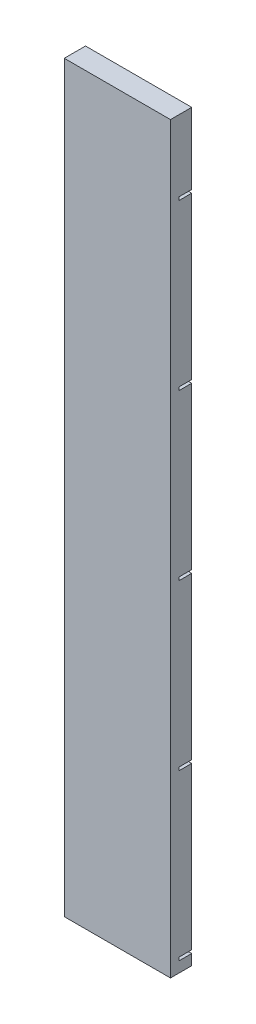
ISO-10303-21;
HEADER;
FILE_DESCRIPTION(('STEP AP214'),'2;1');
FILE_NAME('part.step','',(''),(''),'','','');
FILE_SCHEMA(('AUTOMOTIVE_DESIGN { 1 0 10303 214 1 1 1 1 }'));
ENDSEC;
DATA;
#1=APPLICATION_CONTEXT('core data for automotive mechanical design processes');
#2=APPLICATION_PROTOCOL_DEFINITION('international standard','automotive_design',2000,#1);
#3=PRODUCT_CONTEXT('',#1,'mechanical');
#4=PRODUCT('Part','Part','',(#3));
#5=PRODUCT_RELATED_PRODUCT_CATEGORY('part','',(#4));
#6=PRODUCT_DEFINITION_FORMATION('','',#4);
#7=PRODUCT_DEFINITION_CONTEXT('part definition',#1,'design');
#8=PRODUCT_DEFINITION('design','',#6,#7);
#9=PRODUCT_DEFINITION_SHAPE('','',#8);
#10=(LENGTH_UNIT() NAMED_UNIT(*) SI_UNIT(.MILLI.,.METRE.));
#11=(NAMED_UNIT(*) PLANE_ANGLE_UNIT() SI_UNIT($,.RADIAN.));
#12=(NAMED_UNIT(*) SI_UNIT($,.STERADIAN.) SOLID_ANGLE_UNIT());
#13=UNCERTAINTY_MEASURE_WITH_UNIT(LENGTH_MEASURE(1.E-05),#10,'distance_accuracy_value','');
#14=(GEOMETRIC_REPRESENTATION_CONTEXT(3) GLOBAL_UNCERTAINTY_ASSIGNED_CONTEXT((#13)) GLOBAL_UNIT_ASSIGNED_CONTEXT((#10,
#11,#12)) REPRESENTATION_CONTEXT('',''));
#15=CARTESIAN_POINT('',(0.,0.,0.));
#16=DIRECTION('',(0.,0.,1.));
#17=DIRECTION('',(1.,0.,0.));
#18=AXIS2_PLACEMENT_3D('',#15,#16,#17);
#19=CARTESIAN_POINT('',(50.,0.,0.));
#20=DIRECTION('',(0.,0.,-1.));
#21=DIRECTION('',(-1.,0.,0.));
#22=AXIS2_PLACEMENT_3D('',#19,#20,#21);
#23=PLANE('',#22);
#24=DIRECTION('',(0.,-1.,0.));
#25=VECTOR('',#24,1.);
#26=CARTESIAN_POINT('',(0.,0.,0.));
#27=LINE('',#26,#25);
#28=CARTESIAN_POINT('',(0.,350.,0.));
#29=VERTEX_POINT('',#28);
#30=CARTESIAN_POINT('',(0.,0.,0.));
#31=VERTEX_POINT('',#30);
#32=EDGE_CURVE('E225',#29,#31,#27,.T.);
#33=ORIENTED_EDGE('',*,*,#32,.T.);
#34=DIRECTION('',(-1.,0.,0.));
#35=VECTOR('',#34,1.);
#36=CARTESIAN_POINT('',(50.,0.,0.));
#37=LINE('',#36,#35);
#38=CARTESIAN_POINT('',(50.,0.,0.));
#39=VERTEX_POINT('',#38);
#40=EDGE_CURVE('E11',#39,#31,#37,.T.);
#41=ORIENTED_EDGE('',*,*,#40,.F.);
#42=DIRECTION('',(0.,-1.,0.));
#43=VECTOR('',#42,1.);
#44=CARTESIAN_POINT('',(50.,0.,0.));
#45=LINE('',#44,#43);
#46=CARTESIAN_POINT('',(50.,350.,0.));
#47=VERTEX_POINT('',#46);
#48=EDGE_CURVE('E271',#47,#39,#45,.T.);
#49=ORIENTED_EDGE('',*,*,#48,.F.);
#50=DIRECTION('',(-1.,0.,0.));
#51=VECTOR('',#50,1.);
#52=CARTESIAN_POINT('',(50.,350.,0.));
#53=LINE('',#52,#51);
#54=EDGE_CURVE('E221',#47,#29,#53,.T.);
#55=ORIENTED_EDGE('',*,*,#54,.T.);
#56=EDGE_LOOP('',(#33,#41,#49,#55));
#57=FACE_BOUND('',#56,.T.);
#58=ADVANCED_FACE('F33',(#57),#23,.F.);
#59=CARTESIAN_POINT('',(50.,0.,0.));
#60=DIRECTION('',(0.,1.,0.));
#61=DIRECTION('',(0.,0.,1.));
#62=AXIS2_PLACEMENT_3D('',#59,#60,#61);
#63=PLANE('',#62);
#64=DIRECTION('',(0.,0.,-1.));
#65=VECTOR('',#64,1.);
#66=CARTESIAN_POINT('',(0.,0.,0.));
#67=LINE('',#66,#65);
#68=CARTESIAN_POINT('',(0.,0.,-10.));
#69=VERTEX_POINT('',#68);
#70=EDGE_CURVE('E228',#31,#69,#67,.T.);
#71=ORIENTED_EDGE('',*,*,#70,.T.);
#72=DIRECTION('',(-1.,0.,0.));
#73=VECTOR('',#72,1.);
#74=CARTESIAN_POINT('',(50.,0.,-10.));
#75=LINE('',#74,#73);
#76=CARTESIAN_POINT('',(50.,0.,-10.));
#77=VERTEX_POINT('',#76);
#78=EDGE_CURVE('E41',#77,#69,#75,.T.);
#79=ORIENTED_EDGE('',*,*,#78,.F.);
#80=DIRECTION('',(0.,0.,-1.));
#81=VECTOR('',#80,1.);
#82=CARTESIAN_POINT('',(50.,0.,0.));
#83=LINE('',#82,#81);
#84=EDGE_CURVE('E140',#39,#77,#83,.T.);
#85=ORIENTED_EDGE('',*,*,#84,.F.);
#86=ORIENTED_EDGE('',*,*,#40,.T.);
#87=EDGE_LOOP('',(#71,#79,#85,#86));
#88=FACE_BOUND('',#87,.T.);
#89=ADVANCED_FACE('F409',(#88),#63,.F.);
#90=CARTESIAN_POINT('',(50.,0.,-10.));
#91=DIRECTION('',(0.,0.,1.));
#92=DIRECTION('',(1.,0.,0.));
#93=AXIS2_PLACEMENT_3D('',#90,#91,#92);
#94=PLANE('',#93);
#95=DIRECTION('',(0.,1.,0.));
#96=VECTOR('',#95,1.);
#97=CARTESIAN_POINT('',(0.,0.,-10.));
#98=LINE('',#97,#96);
#99=CARTESIAN_POINT('',(0.,5.,-10.));
#100=VERTEX_POINT('',#99);
#101=EDGE_CURVE('E230',#69,#100,#98,.T.);
#102=ORIENTED_EDGE('',*,*,#101,.T.);
#103=DIRECTION('',(-1.,0.,0.));
#104=VECTOR('',#103,1.);
#105=CARTESIAN_POINT('',(50.,5.,-10.));
#106=LINE('',#105,#104);
#107=CARTESIAN_POINT('',(50.,5.,-10.));
#108=VERTEX_POINT('',#107);
#109=EDGE_CURVE('E326',#108,#100,#106,.T.);
#110=ORIENTED_EDGE('',*,*,#109,.F.);
#111=DIRECTION('',(0.,1.,0.));
#112=VECTOR('',#111,1.);
#113=CARTESIAN_POINT('',(50.,0.,-10.));
#114=LINE('',#113,#112);
#115=EDGE_CURVE('E334',#77,#108,#114,.T.);
#116=ORIENTED_EDGE('',*,*,#115,.F.);
#117=ORIENTED_EDGE('',*,*,#78,.T.);
#118=EDGE_LOOP('',(#102,#110,#116,#117));
#119=FACE_BOUND('',#118,.T.);
#120=ADVANCED_FACE('F332',(#119),#94,.F.);
#121=CARTESIAN_POINT('',(50.,5.,-10.));
#122=DIRECTION('',(0.,-1.,0.));
#123=DIRECTION('',(0.,0.,-1.));
#124=AXIS2_PLACEMENT_3D('',#121,#122,#123);
#125=PLANE('',#124);
#126=DIRECTION('',(0.,0.,1.));
#127=VECTOR('',#126,1.);
#128=CARTESIAN_POINT('',(0.,5.,-10.));
#129=LINE('',#128,#127);
#130=CARTESIAN_POINT('',(0.,5.,-4.));
#131=VERTEX_POINT('',#130);
#132=EDGE_CURVE('E232',#100,#131,#129,.T.);
#133=ORIENTED_EDGE('',*,*,#132,.T.);
#134=DIRECTION('',(-1.,0.,0.));
#135=VECTOR('',#134,1.);
#136=CARTESIAN_POINT('',(50.,5.,-4.));
#137=LINE('',#136,#135);
#138=CARTESIAN_POINT('',(50.,5.,-4.));
#139=VERTEX_POINT('',#138);
#140=EDGE_CURVE('E323',#139,#131,#137,.T.);
#141=ORIENTED_EDGE('',*,*,#140,.F.);
#142=DIRECTION('',(0.,0.,1.));
#143=VECTOR('',#142,1.);
#144=CARTESIAN_POINT('',(50.,5.,-10.));
#145=LINE('',#144,#143);
#146=EDGE_CURVE('E352',#108,#139,#145,.T.);
#147=ORIENTED_EDGE('',*,*,#146,.F.);
#148=ORIENTED_EDGE('',*,*,#109,.T.);
#149=EDGE_LOOP('',(#133,#141,#147,#148));
#150=FACE_BOUND('',#149,.T.);
#151=ADVANCED_FACE('F343',(#150),#125,.F.);
#152=CARTESIAN_POINT('',(50.,5.,-4.));
#153=DIRECTION('',(0.,0.,1.));
#154=DIRECTION('',(1.,0.,0.));
#155=AXIS2_PLACEMENT_3D('',#152,#153,#154);
#156=PLANE('',#155);
#157=DIRECTION('',(0.,1.,0.));
#158=VECTOR('',#157,1.);
#159=CARTESIAN_POINT('',(0.,5.,-4.));
#160=LINE('',#159,#158);
#161=CARTESIAN_POINT('',(0.,6.5,-4.));
#162=VERTEX_POINT('',#161);
#163=EDGE_CURVE('E234',#131,#162,#160,.T.);
#164=ORIENTED_EDGE('',*,*,#163,.T.);
#165=DIRECTION('',(-1.,0.,0.));
#166=VECTOR('',#165,1.);
#167=CARTESIAN_POINT('',(50.,6.5,-4.));
#168=LINE('',#167,#166);
#169=CARTESIAN_POINT('',(50.,6.5,-4.));
#170=VERTEX_POINT('',#169);
#171=EDGE_CURVE('E320',#170,#162,#168,.T.);
#172=ORIENTED_EDGE('',*,*,#171,.F.);
#173=DIRECTION('',(0.,1.,0.));
#174=VECTOR('',#173,1.);
#175=CARTESIAN_POINT('',(50.,5.,-4.));
#176=LINE('',#175,#174);
#177=EDGE_CURVE('E349',#139,#170,#176,.T.);
#178=ORIENTED_EDGE('',*,*,#177,.F.);
#179=ORIENTED_EDGE('',*,*,#140,.T.);
#180=EDGE_LOOP('',(#164,#172,#178,#179));
#181=FACE_BOUND('',#180,.T.);
#182=ADVANCED_FACE('F347',(#181),#156,.F.);
#183=CARTESIAN_POINT('',(50.,6.5,-10.));
#184=DIRECTION('',(0.,1.,0.));
#185=DIRECTION('',(0.,0.,1.));
#186=AXIS2_PLACEMENT_3D('',#183,#184,#185);
#187=PLANE('',#186);
#188=DIRECTION('',(0.,0.,-1.));
#189=VECTOR('',#188,1.);
#190=CARTESIAN_POINT('',(0.,6.5,-10.));
#191=LINE('',#190,#189);
#192=CARTESIAN_POINT('',(0.,6.5,-10.));
#193=VERTEX_POINT('',#192);
#194=EDGE_CURVE('E236',#162,#193,#191,.T.);
#195=ORIENTED_EDGE('',*,*,#194,.T.);
#196=DIRECTION('',(-1.,0.,0.));
#197=VECTOR('',#196,1.);
#198=CARTESIAN_POINT('',(50.,6.5,-10.));
#199=LINE('',#198,#197);
#200=CARTESIAN_POINT('',(50.,6.5,-10.));
#201=VERTEX_POINT('',#200);
#202=EDGE_CURVE('E317',#201,#193,#199,.T.);
#203=ORIENTED_EDGE('',*,*,#202,.F.);
#204=DIRECTION('',(0.,0.,-1.));
#205=VECTOR('',#204,1.);
#206=CARTESIAN_POINT('',(50.,6.5,-10.));
#207=LINE('',#206,#205);
#208=EDGE_CURVE('E351',#170,#201,#207,.T.);
#209=ORIENTED_EDGE('',*,*,#208,.F.);
#210=ORIENTED_EDGE('',*,*,#171,.T.);
#211=EDGE_LOOP('',(#195,#203,#209,#210));
#212=FACE_BOUND('',#211,.T.);
#213=ADVANCED_FACE('F422',(#212),#187,.F.);
#214=CARTESIAN_POINT('',(50.,6.5,-10.));
#215=DIRECTION('',(0.,0.,1.));
#216=DIRECTION('',(1.,0.,0.));
#217=AXIS2_PLACEMENT_3D('',#214,#215,#216);
#218=PLANE('',#217);
#219=DIRECTION('',(0.,1.,0.));
#220=VECTOR('',#219,1.);
#221=CARTESIAN_POINT('',(0.,6.5,-10.));
#222=LINE('',#221,#220);
#223=CARTESIAN_POINT('',(0.,82.5,-10.));
#224=VERTEX_POINT('',#223);
#225=EDGE_CURVE('E238',#193,#224,#222,.T.);
#226=ORIENTED_EDGE('',*,*,#225,.T.);
#227=DIRECTION('',(-1.,0.,0.));
#228=VECTOR('',#227,1.);
#229=CARTESIAN_POINT('',(50.,82.5,-10.));
#230=LINE('',#229,#228);
#231=CARTESIAN_POINT('',(50.,82.5,-10.));
#232=VERTEX_POINT('',#231);
#233=EDGE_CURVE('E314',#232,#224,#230,.T.);
#234=ORIENTED_EDGE('',*,*,#233,.F.);
#235=DIRECTION('',(0.,1.,0.));
#236=VECTOR('',#235,1.);
#237=CARTESIAN_POINT('',(50.,6.5,-10.));
#238=LINE('',#237,#236);
#239=EDGE_CURVE('E354',#201,#232,#238,.T.);
#240=ORIENTED_EDGE('',*,*,#239,.F.);
#241=ORIENTED_EDGE('',*,*,#202,.T.);
#242=EDGE_LOOP('',(#226,#234,#240,#241));
#243=FACE_BOUND('',#242,.T.);
#244=ADVANCED_FACE('F425',(#243),#218,.F.);
#245=CARTESIAN_POINT('',(50.,82.5,-10.));
#246=DIRECTION('',(0.,-1.,0.));
#247=DIRECTION('',(0.,0.,-1.));
#248=AXIS2_PLACEMENT_3D('',#245,#246,#247);
#249=PLANE('',#248);
#250=DIRECTION('',(0.,0.,1.));
#251=VECTOR('',#250,1.);
#252=CARTESIAN_POINT('',(0.,82.5,-10.));
#253=LINE('',#252,#251);
#254=CARTESIAN_POINT('',(0.,82.5,-3.99999999999973));
#255=VERTEX_POINT('',#254);
#256=EDGE_CURVE('E240',#224,#255,#253,.T.);
#257=ORIENTED_EDGE('',*,*,#256,.T.);
#258=DIRECTION('',(-1.,0.,0.));
#259=VECTOR('',#258,1.);
#260=CARTESIAN_POINT('',(50.,82.5,-3.99999999999973));
#261=LINE('',#260,#259);
#262=CARTESIAN_POINT('',(50.,82.5,-3.99999999999973));
#263=VERTEX_POINT('',#262);
#264=EDGE_CURVE('E311',#263,#255,#261,.T.);
#265=ORIENTED_EDGE('',*,*,#264,.F.);
#266=DIRECTION('',(0.,0.,1.));
#267=VECTOR('',#266,1.);
#268=CARTESIAN_POINT('',(50.,82.5,-10.));
#269=LINE('',#268,#267);
#270=EDGE_CURVE('E360',#232,#263,#269,.T.);
#271=ORIENTED_EDGE('',*,*,#270,.F.);
#272=ORIENTED_EDGE('',*,*,#233,.T.);
#273=EDGE_LOOP('',(#257,#265,#271,#272));
#274=FACE_BOUND('',#273,.T.);
#275=ADVANCED_FACE('F429',(#274),#249,.F.);
#276=CARTESIAN_POINT('',(50.,82.5,-3.99999999999973));
#277=DIRECTION('',(0.,0.,1.));
#278=DIRECTION('',(1.,0.,0.));
#279=AXIS2_PLACEMENT_3D('',#276,#277,#278);
#280=PLANE('',#279);
#281=DIRECTION('',(0.,1.,0.));
#282=VECTOR('',#281,1.);
#283=CARTESIAN_POINT('',(0.,82.5,-3.99999999999973));
#284=LINE('',#283,#282);
#285=CARTESIAN_POINT('',(0.,84.,-3.99999999999973));
#286=VERTEX_POINT('',#285);
#287=EDGE_CURVE('E242',#255,#286,#284,.T.);
#288=ORIENTED_EDGE('',*,*,#287,.T.);
#289=DIRECTION('',(-1.,0.,0.));
#290=VECTOR('',#289,1.);
#291=CARTESIAN_POINT('',(50.,84.,-3.99999999999973));
#292=LINE('',#291,#290);
#293=CARTESIAN_POINT('',(50.,84.,-3.99999999999973));
#294=VERTEX_POINT('',#293);
#295=EDGE_CURVE('E308',#294,#286,#292,.T.);
#296=ORIENTED_EDGE('',*,*,#295,.F.);
#297=DIRECTION('',(0.,1.,0.));
#298=VECTOR('',#297,1.);
#299=CARTESIAN_POINT('',(50.,82.5,-3.99999999999973));
#300=LINE('',#299,#298);
#301=EDGE_CURVE('E362',#263,#294,#300,.T.);
#302=ORIENTED_EDGE('',*,*,#301,.F.);
#303=ORIENTED_EDGE('',*,*,#264,.T.);
#304=EDGE_LOOP('',(#288,#296,#302,#303));
#305=FACE_BOUND('',#304,.T.);
#306=ADVANCED_FACE('F433',(#305),#280,.F.);
#307=CARTESIAN_POINT('',(50.,84.,-9.99999999999973));
#308=DIRECTION('',(0.,1.,0.));
#309=DIRECTION('',(0.,0.,1.));
#310=AXIS2_PLACEMENT_3D('',#307,#308,#309);
#311=PLANE('',#310);
#312=DIRECTION('',(0.,0.,-1.));
#313=VECTOR('',#312,1.);
#314=CARTESIAN_POINT('',(0.,84.,-9.99999999999973));
#315=LINE('',#314,#313);
#316=CARTESIAN_POINT('',(0.,84.,-9.99999999999973));
#317=VERTEX_POINT('',#316);
#318=EDGE_CURVE('E244',#286,#317,#315,.T.);
#319=ORIENTED_EDGE('',*,*,#318,.T.);
#320=DIRECTION('',(-1.,0.,0.));
#321=VECTOR('',#320,1.);
#322=CARTESIAN_POINT('',(50.,84.,-9.99999999999973));
#323=LINE('',#322,#321);
#324=CARTESIAN_POINT('',(50.,84.,-9.99999999999973));
#325=VERTEX_POINT('',#324);
#326=EDGE_CURVE('E305',#325,#317,#323,.T.);
#327=ORIENTED_EDGE('',*,*,#326,.F.);
#328=DIRECTION('',(0.,0.,-1.));
#329=VECTOR('',#328,1.);
#330=CARTESIAN_POINT('',(50.,84.,-9.99999999999973));
#331=LINE('',#330,#329);
#332=EDGE_CURVE('E364',#294,#325,#331,.T.);
#333=ORIENTED_EDGE('',*,*,#332,.F.);
#334=ORIENTED_EDGE('',*,*,#295,.T.);
#335=EDGE_LOOP('',(#319,#327,#333,#334));
#336=FACE_BOUND('',#335,.T.);
#337=ADVANCED_FACE('F437',(#336),#311,.F.);
#338=CARTESIAN_POINT('',(50.,84.,-9.99999999999973));
#339=DIRECTION('',(0.,0.,1.));
#340=DIRECTION('',(1.,0.,0.));
#341=AXIS2_PLACEMENT_3D('',#338,#339,#340);
#342=PLANE('',#341);
#343=DIRECTION('',(0.,1.,0.));
#344=VECTOR('',#343,1.);
#345=CARTESIAN_POINT('',(0.,84.,-9.99999999999973));
#346=LINE('',#345,#344);
#347=CARTESIAN_POINT('',(0.,160.,-9.99999999999973));
#348=VERTEX_POINT('',#347);
#349=EDGE_CURVE('E246',#317,#348,#346,.T.);
#350=ORIENTED_EDGE('',*,*,#349,.T.);
#351=DIRECTION('',(-1.,0.,0.));
#352=VECTOR('',#351,1.);
#353=CARTESIAN_POINT('',(50.,160.,-9.99999999999973));
#354=LINE('',#353,#352);
#355=CARTESIAN_POINT('',(50.,160.,-9.99999999999973));
#356=VERTEX_POINT('',#355);
#357=EDGE_CURVE('E302',#356,#348,#354,.T.);
#358=ORIENTED_EDGE('',*,*,#357,.F.);
#359=DIRECTION('',(0.,1.,0.));
#360=VECTOR('',#359,1.);
#361=CARTESIAN_POINT('',(50.,84.,-9.99999999999973));
#362=LINE('',#361,#360);
#363=EDGE_CURVE('E366',#325,#356,#362,.T.);
#364=ORIENTED_EDGE('',*,*,#363,.F.);
#365=ORIENTED_EDGE('',*,*,#326,.T.);
#366=EDGE_LOOP('',(#350,#358,#364,#365));
#367=FACE_BOUND('',#366,.T.);
#368=ADVANCED_FACE('F441',(#367),#342,.F.);
#369=CARTESIAN_POINT('',(50.,160.,-9.99999999999973));
#370=DIRECTION('',(0.,-1.,0.));
#371=DIRECTION('',(0.,0.,-1.));
#372=AXIS2_PLACEMENT_3D('',#369,#370,#371);
#373=PLANE('',#372);
#374=DIRECTION('',(0.,0.,1.));
#375=VECTOR('',#374,1.);
#376=CARTESIAN_POINT('',(0.,160.,-9.99999999999973));
#377=LINE('',#376,#375);
#378=CARTESIAN_POINT('',(0.,160.,-3.99999999999946));
#379=VERTEX_POINT('',#378);
#380=EDGE_CURVE('E248',#348,#379,#377,.T.);
#381=ORIENTED_EDGE('',*,*,#380,.T.);
#382=DIRECTION('',(-1.,0.,0.));
#383=VECTOR('',#382,1.);
#384=CARTESIAN_POINT('',(50.,160.,-3.99999999999946));
#385=LINE('',#384,#383);
#386=CARTESIAN_POINT('',(50.,160.,-3.99999999999946));
#387=VERTEX_POINT('',#386);
#388=EDGE_CURVE('E299',#387,#379,#385,.T.);
#389=ORIENTED_EDGE('',*,*,#388,.F.);
#390=DIRECTION('',(0.,0.,1.));
#391=VECTOR('',#390,1.);
#392=CARTESIAN_POINT('',(50.,160.,-9.99999999999973));
#393=LINE('',#392,#391);
#394=EDGE_CURVE('E368',#356,#387,#393,.T.);
#395=ORIENTED_EDGE('',*,*,#394,.F.);
#396=ORIENTED_EDGE('',*,*,#357,.T.);
#397=EDGE_LOOP('',(#381,#389,#395,#396));
#398=FACE_BOUND('',#397,.T.);
#399=ADVANCED_FACE('F445',(#398),#373,.F.);
#400=CARTESIAN_POINT('',(50.,160.,-3.99999999999946));
#401=DIRECTION('',(0.,0.,1.));
#402=DIRECTION('',(1.,0.,0.));
#403=AXIS2_PLACEMENT_3D('',#400,#401,#402);
#404=PLANE('',#403);
#405=DIRECTION('',(0.,1.,0.));
#406=VECTOR('',#405,1.);
#407=CARTESIAN_POINT('',(0.,160.,-3.99999999999946));
#408=LINE('',#407,#406);
#409=CARTESIAN_POINT('',(0.,161.5,-3.99999999999946));
#410=VERTEX_POINT('',#409);
#411=EDGE_CURVE('E250',#379,#410,#408,.T.);
#412=ORIENTED_EDGE('',*,*,#411,.T.);
#413=DIRECTION('',(-1.,0.,0.));
#414=VECTOR('',#413,1.);
#415=CARTESIAN_POINT('',(50.,161.5,-3.99999999999946));
#416=LINE('',#415,#414);
#417=CARTESIAN_POINT('',(50.,161.5,-3.99999999999946));
#418=VERTEX_POINT('',#417);
#419=EDGE_CURVE('E296',#418,#410,#416,.T.);
#420=ORIENTED_EDGE('',*,*,#419,.F.);
#421=DIRECTION('',(0.,1.,0.));
#422=VECTOR('',#421,1.);
#423=CARTESIAN_POINT('',(50.,160.,-3.99999999999946));
#424=LINE('',#423,#422);
#425=EDGE_CURVE('E370',#387,#418,#424,.T.);
#426=ORIENTED_EDGE('',*,*,#425,.F.);
#427=ORIENTED_EDGE('',*,*,#388,.T.);
#428=EDGE_LOOP('',(#412,#420,#426,#427));
#429=FACE_BOUND('',#428,.T.);
#430=ADVANCED_FACE('F449',(#429),#404,.F.);
#431=CARTESIAN_POINT('',(50.,161.5,-9.99999999999946));
#432=DIRECTION('',(0.,1.,0.));
#433=DIRECTION('',(0.,0.,1.));
#434=AXIS2_PLACEMENT_3D('',#431,#432,#433);
#435=PLANE('',#434);
#436=DIRECTION('',(0.,0.,-1.));
#437=VECTOR('',#436,1.);
#438=CARTESIAN_POINT('',(0.,161.5,-9.99999999999946));
#439=LINE('',#438,#437);
#440=CARTESIAN_POINT('',(0.,161.5,-9.99999999999946));
#441=VERTEX_POINT('',#440);
#442=EDGE_CURVE('E252',#410,#441,#439,.T.);
#443=ORIENTED_EDGE('',*,*,#442,.T.);
#444=DIRECTION('',(-1.,0.,0.));
#445=VECTOR('',#444,1.);
#446=CARTESIAN_POINT('',(50.,161.5,-9.99999999999946));
#447=LINE('',#446,#445);
#448=CARTESIAN_POINT('',(50.,161.5,-9.99999999999946));
#449=VERTEX_POINT('',#448);
#450=EDGE_CURVE('E293',#449,#441,#447,.T.);
#451=ORIENTED_EDGE('',*,*,#450,.F.);
#452=DIRECTION('',(0.,0.,-1.));
#453=VECTOR('',#452,1.);
#454=CARTESIAN_POINT('',(50.,161.5,-9.99999999999946));
#455=LINE('',#454,#453);
#456=EDGE_CURVE('E372',#418,#449,#455,.T.);
#457=ORIENTED_EDGE('',*,*,#456,.F.);
#458=ORIENTED_EDGE('',*,*,#419,.T.);
#459=EDGE_LOOP('',(#443,#451,#457,#458));
#460=FACE_BOUND('',#459,.T.);
#461=ADVANCED_FACE('F453',(#460),#435,.F.);
#462=CARTESIAN_POINT('',(50.,161.5,-9.99999999999946));
#463=DIRECTION('',(0.,0.,1.));
#464=DIRECTION('',(1.,0.,0.));
#465=AXIS2_PLACEMENT_3D('',#462,#463,#464);
#466=PLANE('',#465);
#467=DIRECTION('',(0.,1.,0.));
#468=VECTOR('',#467,1.);
#469=CARTESIAN_POINT('',(0.,161.5,-9.99999999999946));
#470=LINE('',#469,#468);
#471=CARTESIAN_POINT('',(0.,237.5,-9.99999999999946));
#472=VERTEX_POINT('',#471);
#473=EDGE_CURVE('E254',#441,#472,#470,.T.);
#474=ORIENTED_EDGE('',*,*,#473,.T.);
#475=DIRECTION('',(-1.,0.,0.));
#476=VECTOR('',#475,1.);
#477=CARTESIAN_POINT('',(50.,237.5,-9.99999999999946));
#478=LINE('',#477,#476);
#479=CARTESIAN_POINT('',(50.,237.5,-9.99999999999946));
#480=VERTEX_POINT('',#479);
#481=EDGE_CURVE('E290',#480,#472,#478,.T.);
#482=ORIENTED_EDGE('',*,*,#481,.F.);
#483=DIRECTION('',(0.,1.,0.));
#484=VECTOR('',#483,1.);
#485=CARTESIAN_POINT('',(50.,161.5,-9.99999999999946));
#486=LINE('',#485,#484);
#487=EDGE_CURVE('E374',#449,#480,#486,.T.);
#488=ORIENTED_EDGE('',*,*,#487,.F.);
#489=ORIENTED_EDGE('',*,*,#450,.T.);
#490=EDGE_LOOP('',(#474,#482,#488,#489));
#491=FACE_BOUND('',#490,.T.);
#492=ADVANCED_FACE('F457',(#491),#466,.F.);
#493=CARTESIAN_POINT('',(50.,237.5,-9.99999999999946));
#494=DIRECTION('',(0.,-1.,0.));
#495=DIRECTION('',(0.,0.,-1.));
#496=AXIS2_PLACEMENT_3D('',#493,#494,#495);
#497=PLANE('',#496);
#498=DIRECTION('',(0.,0.,1.));
#499=VECTOR('',#498,1.);
#500=CARTESIAN_POINT('',(0.,237.5,-9.99999999999946));
#501=LINE('',#500,#499);
#502=CARTESIAN_POINT('',(0.,237.5,-3.99999999999919));
#503=VERTEX_POINT('',#502);
#504=EDGE_CURVE('E256',#472,#503,#501,.T.);
#505=ORIENTED_EDGE('',*,*,#504,.T.);
#506=DIRECTION('',(-1.,0.,0.));
#507=VECTOR('',#506,1.);
#508=CARTESIAN_POINT('',(50.,237.5,-3.99999999999919));
#509=LINE('',#508,#507);
#510=CARTESIAN_POINT('',(50.,237.5,-3.99999999999919));
#511=VERTEX_POINT('',#510);
#512=EDGE_CURVE('E287',#511,#503,#509,.T.);
#513=ORIENTED_EDGE('',*,*,#512,.F.);
#514=DIRECTION('',(0.,0.,1.));
#515=VECTOR('',#514,1.);
#516=CARTESIAN_POINT('',(50.,237.5,-9.99999999999946));
#517=LINE('',#516,#515);
#518=EDGE_CURVE('E376',#480,#511,#517,.T.);
#519=ORIENTED_EDGE('',*,*,#518,.F.);
#520=ORIENTED_EDGE('',*,*,#481,.T.);
#521=EDGE_LOOP('',(#505,#513,#519,#520));
#522=FACE_BOUND('',#521,.T.);
#523=ADVANCED_FACE('F461',(#522),#497,.F.);
#524=CARTESIAN_POINT('',(50.,237.5,-3.99999999999919));
#525=DIRECTION('',(0.,0.,1.));
#526=DIRECTION('',(1.,0.,0.));
#527=AXIS2_PLACEMENT_3D('',#524,#525,#526);
#528=PLANE('',#527);
#529=DIRECTION('',(0.,1.,0.));
#530=VECTOR('',#529,1.);
#531=CARTESIAN_POINT('',(0.,237.5,-3.99999999999919));
#532=LINE('',#531,#530);
#533=CARTESIAN_POINT('',(0.,239.,-3.99999999999919));
#534=VERTEX_POINT('',#533);
#535=EDGE_CURVE('E258',#503,#534,#532,.T.);
#536=ORIENTED_EDGE('',*,*,#535,.T.);
#537=DIRECTION('',(-1.,0.,0.));
#538=VECTOR('',#537,1.);
#539=CARTESIAN_POINT('',(50.,239.,-3.99999999999919));
#540=LINE('',#539,#538);
#541=CARTESIAN_POINT('',(50.,239.,-3.99999999999919));
#542=VERTEX_POINT('',#541);
#543=EDGE_CURVE('E284',#542,#534,#540,.T.);
#544=ORIENTED_EDGE('',*,*,#543,.F.);
#545=DIRECTION('',(0.,1.,0.));
#546=VECTOR('',#545,1.);
#547=CARTESIAN_POINT('',(50.,237.5,-3.99999999999919));
#548=LINE('',#547,#546);
#549=EDGE_CURVE('E378',#511,#542,#548,.T.);
#550=ORIENTED_EDGE('',*,*,#549,.F.);
#551=ORIENTED_EDGE('',*,*,#512,.T.);
#552=EDGE_LOOP('',(#536,#544,#550,#551));
#553=FACE_BOUND('',#552,.T.);
#554=ADVANCED_FACE('F465',(#553),#528,.F.);
#555=CARTESIAN_POINT('',(50.,239.,-9.99999999999919));
#556=DIRECTION('',(0.,1.,0.));
#557=DIRECTION('',(0.,0.,1.));
#558=AXIS2_PLACEMENT_3D('',#555,#556,#557);
#559=PLANE('',#558);
#560=DIRECTION('',(0.,0.,-1.));
#561=VECTOR('',#560,1.);
#562=CARTESIAN_POINT('',(0.,239.,-9.99999999999919));
#563=LINE('',#562,#561);
#564=CARTESIAN_POINT('',(0.,239.,-9.99999999999919));
#565=VERTEX_POINT('',#564);
#566=EDGE_CURVE('E260',#534,#565,#563,.T.);
#567=ORIENTED_EDGE('',*,*,#566,.T.);
#568=DIRECTION('',(-1.,0.,0.));
#569=VECTOR('',#568,1.);
#570=CARTESIAN_POINT('',(50.,239.,-9.99999999999919));
#571=LINE('',#570,#569);
#572=CARTESIAN_POINT('',(50.,239.,-9.99999999999919));
#573=VERTEX_POINT('',#572);
#574=EDGE_CURVE('E281',#573,#565,#571,.T.);
#575=ORIENTED_EDGE('',*,*,#574,.F.);
#576=DIRECTION('',(0.,0.,-1.));
#577=VECTOR('',#576,1.);
#578=CARTESIAN_POINT('',(50.,239.,-9.99999999999919));
#579=LINE('',#578,#577);
#580=EDGE_CURVE('E380',#542,#573,#579,.T.);
#581=ORIENTED_EDGE('',*,*,#580,.F.);
#582=ORIENTED_EDGE('',*,*,#543,.T.);
#583=EDGE_LOOP('',(#567,#575,#581,#582));
#584=FACE_BOUND('',#583,.T.);
#585=ADVANCED_FACE('F469',(#584),#559,.F.);
#586=CARTESIAN_POINT('',(50.,239.,-9.99999999999919));
#587=DIRECTION('',(0.,0.,1.));
#588=DIRECTION('',(1.,0.,0.));
#589=AXIS2_PLACEMENT_3D('',#586,#587,#588);
#590=PLANE('',#589);
#591=DIRECTION('',(0.,1.,0.));
#592=VECTOR('',#591,1.);
#593=CARTESIAN_POINT('',(0.,239.,-9.99999999999919));
#594=LINE('',#593,#592);
#595=CARTESIAN_POINT('',(0.,315.,-9.99999999999919));
#596=VERTEX_POINT('',#595);
#597=EDGE_CURVE('E262',#565,#596,#594,.T.);
#598=ORIENTED_EDGE('',*,*,#597,.T.);
#599=DIRECTION('',(-1.,0.,0.));
#600=VECTOR('',#599,1.);
#601=CARTESIAN_POINT('',(50.,315.,-9.99999999999919));
#602=LINE('',#601,#600);
#603=CARTESIAN_POINT('',(50.,315.,-9.99999999999919));
#604=VERTEX_POINT('',#603);
#605=EDGE_CURVE('E278',#604,#596,#602,.T.);
#606=ORIENTED_EDGE('',*,*,#605,.F.);
#607=DIRECTION('',(0.,1.,0.));
#608=VECTOR('',#607,1.);
#609=CARTESIAN_POINT('',(50.,239.,-9.99999999999919));
#610=LINE('',#609,#608);
#611=EDGE_CURVE('E382',#573,#604,#610,.T.);
#612=ORIENTED_EDGE('',*,*,#611,.F.);
#613=ORIENTED_EDGE('',*,*,#574,.T.);
#614=EDGE_LOOP('',(#598,#606,#612,#613));
#615=FACE_BOUND('',#614,.T.);
#616=ADVANCED_FACE('F473',(#615),#590,.F.);
#617=CARTESIAN_POINT('',(50.,315.,-9.99999999999919));
#618=DIRECTION('',(0.,-1.,0.));
#619=DIRECTION('',(0.,0.,-1.));
#620=AXIS2_PLACEMENT_3D('',#617,#618,#619);
#621=PLANE('',#620);
#622=DIRECTION('',(0.,0.,1.));
#623=VECTOR('',#622,1.);
#624=CARTESIAN_POINT('',(0.,315.,-9.99999999999919));
#625=LINE('',#624,#623);
#626=CARTESIAN_POINT('',(0.,315.,-3.99999999999892));
#627=VERTEX_POINT('',#626);
#628=EDGE_CURVE('E264',#596,#627,#625,.T.);
#629=ORIENTED_EDGE('',*,*,#628,.T.);
#630=DIRECTION('',(-1.,0.,0.));
#631=VECTOR('',#630,1.);
#632=CARTESIAN_POINT('',(50.,315.,-3.99999999999892));
#633=LINE('',#632,#631);
#634=CARTESIAN_POINT('',(50.,315.,-3.99999999999892));
#635=VERTEX_POINT('',#634);
#636=EDGE_CURVE('E275',#635,#627,#633,.T.);
#637=ORIENTED_EDGE('',*,*,#636,.F.);
#638=DIRECTION('',(0.,0.,1.));
#639=VECTOR('',#638,1.);
#640=CARTESIAN_POINT('',(50.,315.,-9.99999999999919));
#641=LINE('',#640,#639);
#642=EDGE_CURVE('E384',#604,#635,#641,.T.);
#643=ORIENTED_EDGE('',*,*,#642,.F.);
#644=ORIENTED_EDGE('',*,*,#605,.T.);
#645=EDGE_LOOP('',(#629,#637,#643,#644));
#646=FACE_BOUND('',#645,.T.);
#647=ADVANCED_FACE('F390',(#646),#621,.F.);
#648=CARTESIAN_POINT('',(50.,315.,-3.99999999999892));
#649=DIRECTION('',(0.,0.,1.));
#650=DIRECTION('',(1.,0.,0.));
#651=AXIS2_PLACEMENT_3D('',#648,#649,#650);
#652=PLANE('',#651);
#653=DIRECTION('',(0.,1.,0.));
#654=VECTOR('',#653,1.);
#655=CARTESIAN_POINT('',(0.,315.,-3.99999999999892));
#656=LINE('',#655,#654);
#657=CARTESIAN_POINT('',(0.,316.5,-3.99999999999892));
#658=VERTEX_POINT('',#657);
#659=EDGE_CURVE('E266',#627,#658,#656,.T.);
#660=ORIENTED_EDGE('',*,*,#659,.T.);
#661=DIRECTION('',(-1.,0.,0.));
#662=VECTOR('',#661,1.);
#663=CARTESIAN_POINT('',(50.,316.5,-3.99999999999892));
#664=LINE('',#663,#662);
#665=CARTESIAN_POINT('',(50.,316.5,-3.99999999999892));
#666=VERTEX_POINT('',#665);
#667=EDGE_CURVE('E216',#666,#658,#664,.T.);
#668=ORIENTED_EDGE('',*,*,#667,.F.);
#669=DIRECTION('',(0.,1.,0.));
#670=VECTOR('',#669,1.);
#671=CARTESIAN_POINT('',(50.,315.,-3.99999999999892));
#672=LINE('',#671,#670);
#673=EDGE_CURVE('E207',#635,#666,#672,.T.);
#674=ORIENTED_EDGE('',*,*,#673,.F.);
#675=ORIENTED_EDGE('',*,*,#636,.T.);
#676=EDGE_LOOP('',(#660,#668,#674,#675));
#677=FACE_BOUND('',#676,.T.);
#678=ADVANCED_FACE('F394',(#677),#652,.F.);
#679=CARTESIAN_POINT('',(50.,316.5,-9.99999999999892));
#680=DIRECTION('',(0.,1.,0.));
#681=DIRECTION('',(0.,0.,1.));
#682=AXIS2_PLACEMENT_3D('',#679,#680,#681);
#683=PLANE('',#682);
#684=DIRECTION('',(0.,0.,-1.));
#685=VECTOR('',#684,1.);
#686=CARTESIAN_POINT('',(0.,316.5,-9.99999999999892));
#687=LINE('',#686,#685);
#688=CARTESIAN_POINT('',(0.,316.5,-9.99999999999892));
#689=VERTEX_POINT('',#688);
#690=EDGE_CURVE('E215',#658,#689,#687,.T.);
#691=ORIENTED_EDGE('',*,*,#690,.T.);
#692=DIRECTION('',(-1.,0.,0.));
#693=VECTOR('',#692,1.);
#694=CARTESIAN_POINT('',(50.,316.5,-9.99999999999892));
#695=LINE('',#694,#693);
#696=CARTESIAN_POINT('',(50.,316.5,-9.99999999999892));
#697=VERTEX_POINT('',#696);
#698=EDGE_CURVE('E212',#697,#689,#695,.T.);
#699=ORIENTED_EDGE('',*,*,#698,.F.);
#700=DIRECTION('',(0.,0.,-1.));
#701=VECTOR('',#700,1.);
#702=CARTESIAN_POINT('',(50.,316.5,-9.99999999999892));
#703=LINE('',#702,#701);
#704=EDGE_CURVE('E201',#666,#697,#703,.T.);
#705=ORIENTED_EDGE('',*,*,#704,.F.);
#706=ORIENTED_EDGE('',*,*,#667,.T.);
#707=EDGE_LOOP('',(#691,#699,#705,#706));
#708=FACE_BOUND('',#707,.T.);
#709=ADVANCED_FACE('F213',(#708),#683,.F.);
#710=CARTESIAN_POINT('',(50.,316.5,-9.99999999999892));
#711=DIRECTION('',(0.,0.,1.));
#712=DIRECTION('',(0.,-1.,0.));
#713=AXIS2_PLACEMENT_3D('',#710,#711,#712);
#714=PLANE('',#713);
#715=DIRECTION('',(0.,1.,0.));
#716=VECTOR('',#715,1.);
#717=CARTESIAN_POINT('',(0.,316.5,-9.99999999999892));
#718=LINE('',#717,#716);
#719=CARTESIAN_POINT('',(0.,350.,-10.));
#720=VERTEX_POINT('',#719);
#721=EDGE_CURVE('E126',#689,#720,#718,.T.);
#722=ORIENTED_EDGE('',*,*,#721,.T.);
#723=DIRECTION('',(-1.,0.,0.));
#724=VECTOR('',#723,1.);
#725=CARTESIAN_POINT('',(50.,350.,-10.));
#726=LINE('',#725,#724);
#727=CARTESIAN_POINT('',(50.,350.,-10.));
#728=VERTEX_POINT('',#727);
#729=EDGE_CURVE('E217',#728,#720,#726,.T.);
#730=ORIENTED_EDGE('',*,*,#729,.F.);
#731=DIRECTION('',(0.,1.,0.));
#732=VECTOR('',#731,1.);
#733=CARTESIAN_POINT('',(50.,316.5,-9.99999999999892));
#734=LINE('',#733,#732);
#735=EDGE_CURVE('E205',#697,#728,#734,.T.);
#736=ORIENTED_EDGE('',*,*,#735,.F.);
#737=ORIENTED_EDGE('',*,*,#698,.T.);
#738=EDGE_LOOP('',(#722,#730,#736,#737));
#739=FACE_BOUND('',#738,.T.);
#740=ADVANCED_FACE('F219',(#739),#714,.F.);
#741=CARTESIAN_POINT('',(50.,350.,0.));
#742=DIRECTION('',(0.,-1.,0.));
#743=DIRECTION('',(0.,0.,-1.));
#744=AXIS2_PLACEMENT_3D('',#741,#742,#743);
#745=PLANE('',#744);
#746=DIRECTION('',(0.,0.,1.));
#747=VECTOR('',#746,1.);
#748=CARTESIAN_POINT('',(0.,350.,0.));
#749=LINE('',#748,#747);
#750=EDGE_CURVE('E132',#720,#29,#749,.T.);
#751=ORIENTED_EDGE('',*,*,#750,.T.);
#752=ORIENTED_EDGE('',*,*,#54,.F.);
#753=DIRECTION('',(0.,0.,1.));
#754=VECTOR('',#753,1.);
#755=CARTESIAN_POINT('',(50.,350.,0.));
#756=LINE('',#755,#754);
#757=EDGE_CURVE('E49',#728,#47,#756,.T.);
#758=ORIENTED_EDGE('',*,*,#757,.F.);
#759=ORIENTED_EDGE('',*,*,#729,.T.);
#760=EDGE_LOOP('',(#751,#752,#758,#759));
#761=FACE_BOUND('',#760,.T.);
#762=ADVANCED_FACE('F398',(#761),#745,.F.);
#763=CARTESIAN_POINT('',(50.,0.,0.));
#764=DIRECTION('',(-1.,0.,0.));
#765=DIRECTION('',(0.,0.,1.));
#766=AXIS2_PLACEMENT_3D('',#763,#764,#765);
#767=PLANE('',#766);
#768=ORIENTED_EDGE('',*,*,#48,.T.);
#769=ORIENTED_EDGE('',*,*,#84,.T.);
#770=ORIENTED_EDGE('',*,*,#115,.T.);
#771=ORIENTED_EDGE('',*,*,#146,.T.);
#772=ORIENTED_EDGE('',*,*,#177,.T.);
#773=ORIENTED_EDGE('',*,*,#208,.T.);
#774=ORIENTED_EDGE('',*,*,#239,.T.);
#775=ORIENTED_EDGE('',*,*,#270,.T.);
#776=ORIENTED_EDGE('',*,*,#301,.T.);
#777=ORIENTED_EDGE('',*,*,#332,.T.);
#778=ORIENTED_EDGE('',*,*,#363,.T.);
#779=ORIENTED_EDGE('',*,*,#394,.T.);
#780=ORIENTED_EDGE('',*,*,#425,.T.);
#781=ORIENTED_EDGE('',*,*,#456,.T.);
#782=ORIENTED_EDGE('',*,*,#487,.T.);
#783=ORIENTED_EDGE('',*,*,#518,.T.);
#784=ORIENTED_EDGE('',*,*,#549,.T.);
#785=ORIENTED_EDGE('',*,*,#580,.T.);
#786=ORIENTED_EDGE('',*,*,#611,.T.);
#787=ORIENTED_EDGE('',*,*,#642,.T.);
#788=ORIENTED_EDGE('',*,*,#673,.T.);
#789=ORIENTED_EDGE('',*,*,#704,.T.);
#790=ORIENTED_EDGE('',*,*,#735,.T.);
#791=ORIENTED_EDGE('',*,*,#757,.T.);
#792=EDGE_LOOP('',(#768,#769,#770,#771,#772,#773,#774,#775,#776,#777,#778,#779,#780,#781,#782,
#783,#784,#785,#786,#787,#788,#789,#790,#791));
#793=FACE_BOUND('',#792,.T.);
#794=ADVANCED_FACE('F203',(#793),#767,.F.);
#795=CARTESIAN_POINT('',(0.,0.,0.));
#796=DIRECTION('',(-1.,0.,0.));
#797=DIRECTION('',(0.,0.,1.));
#798=AXIS2_PLACEMENT_3D('',#795,#796,#797);
#799=PLANE('',#798);
#800=ORIENTED_EDGE('',*,*,#32,.F.);
#801=ORIENTED_EDGE('',*,*,#750,.F.);
#802=ORIENTED_EDGE('',*,*,#721,.F.);
#803=ORIENTED_EDGE('',*,*,#690,.F.);
#804=ORIENTED_EDGE('',*,*,#659,.F.);
#805=ORIENTED_EDGE('',*,*,#628,.F.);
#806=ORIENTED_EDGE('',*,*,#597,.F.);
#807=ORIENTED_EDGE('',*,*,#566,.F.);
#808=ORIENTED_EDGE('',*,*,#535,.F.);
#809=ORIENTED_EDGE('',*,*,#504,.F.);
#810=ORIENTED_EDGE('',*,*,#473,.F.);
#811=ORIENTED_EDGE('',*,*,#442,.F.);
#812=ORIENTED_EDGE('',*,*,#411,.F.);
#813=ORIENTED_EDGE('',*,*,#380,.F.);
#814=ORIENTED_EDGE('',*,*,#349,.F.);
#815=ORIENTED_EDGE('',*,*,#318,.F.);
#816=ORIENTED_EDGE('',*,*,#287,.F.);
#817=ORIENTED_EDGE('',*,*,#256,.F.);
#818=ORIENTED_EDGE('',*,*,#225,.F.);
#819=ORIENTED_EDGE('',*,*,#194,.F.);
#820=ORIENTED_EDGE('',*,*,#163,.F.);
#821=ORIENTED_EDGE('',*,*,#132,.F.);
#822=ORIENTED_EDGE('',*,*,#101,.F.);
#823=ORIENTED_EDGE('',*,*,#70,.F.);
#824=EDGE_LOOP('',(#800,#801,#802,#803,#804,#805,#806,#807,#808,#809,#810,#811,#812,#813,#814,
#815,#816,#817,#818,#819,#820,#821,#822,#823));
#825=FACE_BOUND('',#824,.T.);
#826=ADVANCED_FACE('F338',(#825),#799,.T.);
#827=CLOSED_SHELL('',(#58,#89,#120,#151,#182,#213,#244,#275,#306,#337,#368,#399,#430,#461,#492,
#523,#554,#585,#616,#647,#678,#709,#740,#762,#794,#826));
#828=MANIFOLD_SOLID_BREP('B2',#827);
#829=ADVANCED_BREP_SHAPE_REPRESENTATION('',(#18,#828),#14);
#830=SHAPE_DEFINITION_REPRESENTATION(#9,#829);
ENDSEC;
END-ISO-10303-21;
